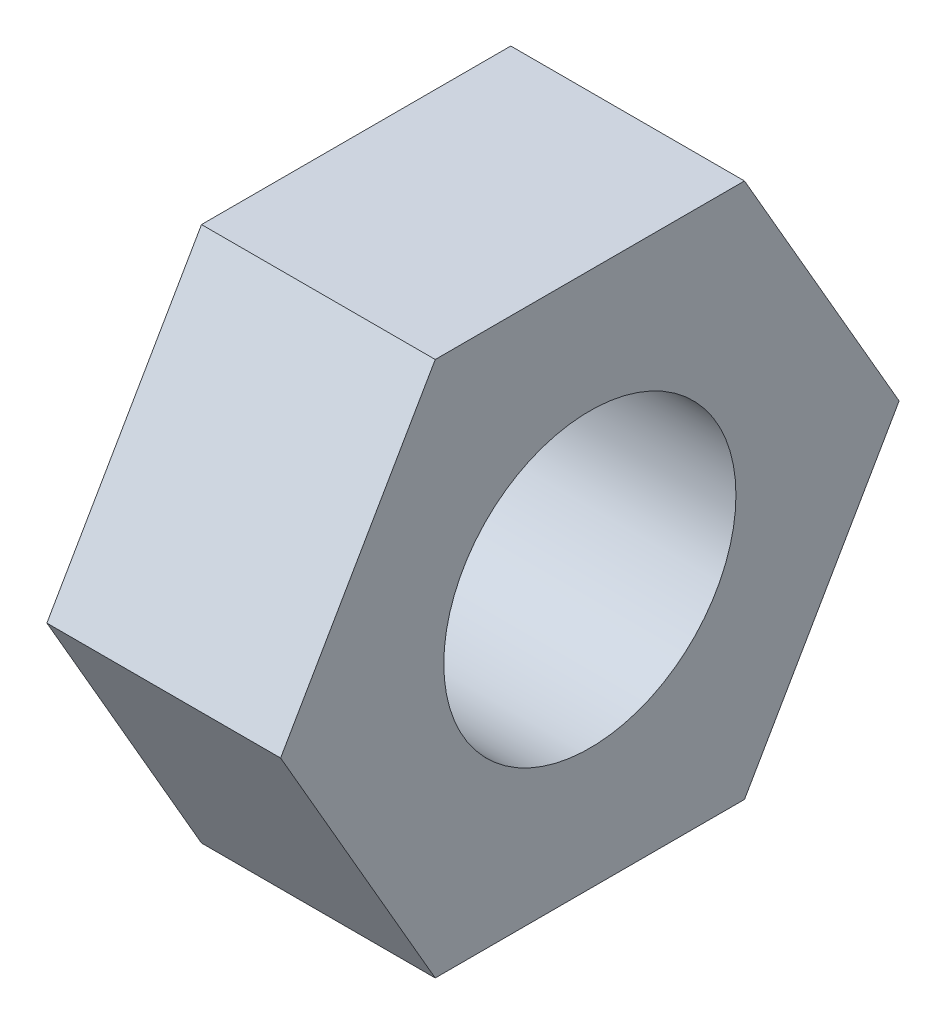
ISO-10303-21;
HEADER;
FILE_DESCRIPTION(('STEP AP214'),'2;1');
FILE_NAME('part.step','',(''),(''),'','','');
FILE_SCHEMA(('AUTOMOTIVE_DESIGN { 1 0 10303 214 1 1 1 1 }'));
ENDSEC;
DATA;
#1=APPLICATION_CONTEXT('core data for automotive mechanical design processes');
#2=APPLICATION_PROTOCOL_DEFINITION('international standard','automotive_design',2000,#1);
#3=PRODUCT_CONTEXT('',#1,'mechanical');
#4=PRODUCT('Part','Part','',(#3));
#5=PRODUCT_RELATED_PRODUCT_CATEGORY('part','',(#4));
#6=PRODUCT_DEFINITION_FORMATION('','',#4);
#7=PRODUCT_DEFINITION_CONTEXT('part definition',#1,'design');
#8=PRODUCT_DEFINITION('design','',#6,#7);
#9=PRODUCT_DEFINITION_SHAPE('','',#8);
#10=(LENGTH_UNIT() NAMED_UNIT(*) SI_UNIT(.MILLI.,.METRE.));
#11=(NAMED_UNIT(*) PLANE_ANGLE_UNIT() SI_UNIT($,.RADIAN.));
#12=(NAMED_UNIT(*) SI_UNIT($,.STERADIAN.) SOLID_ANGLE_UNIT());
#13=UNCERTAINTY_MEASURE_WITH_UNIT(LENGTH_MEASURE(1.E-05),#10,'distance_accuracy_value','');
#14=(GEOMETRIC_REPRESENTATION_CONTEXT(3) GLOBAL_UNCERTAINTY_ASSIGNED_CONTEXT((#13)) GLOBAL_UNIT_ASSIGNED_CONTEXT((#10,
#11,#12)) REPRESENTATION_CONTEXT('',''));
#15=CARTESIAN_POINT('',(0.,0.,0.));
#16=DIRECTION('',(0.,0.,1.));
#17=DIRECTION('',(1.,0.,0.));
#18=AXIS2_PLACEMENT_3D('',#15,#16,#17);
#19=CARTESIAN_POINT('',(23.1,-35.25,-13.0877132402715));
#20=DIRECTION('',(0.,-1.,0.));
#21=DIRECTION('',(0.,0.,-1.));
#22=AXIS2_PLACEMENT_3D('',#19,#20,#21);
#23=PLANE('',#22);
#24=DIRECTION('',(0.,0.,1.));
#25=VECTOR('',#24,1.);
#26=CARTESIAN_POINT('',(20.7,-35.25,-13.0877132402715));
#27=LINE('',#26,#25);
#28=CARTESIAN_POINT('',(20.7,-35.25,-13.0877132402715));
#29=VERTEX_POINT('',#28);
#30=CARTESIAN_POINT('',(20.7,-35.25,-9.91228675972853));
#31=VERTEX_POINT('',#30);
#32=EDGE_CURVE('E127',#29,#31,#27,.T.);
#33=ORIENTED_EDGE('',*,*,#32,.T.);
#34=DIRECTION('',(-1.,0.,0.));
#35=VECTOR('',#34,1.);
#36=CARTESIAN_POINT('',(23.1,-35.25,-9.91228675972853));
#37=LINE('',#36,#35);
#38=CARTESIAN_POINT('',(23.1,-35.25,-9.91228675972853));
#39=VERTEX_POINT('',#38);
#40=EDGE_CURVE('E11',#39,#31,#37,.T.);
#41=ORIENTED_EDGE('',*,*,#40,.F.);
#42=DIRECTION('',(0.,0.,1.));
#43=VECTOR('',#42,1.);
#44=CARTESIAN_POINT('',(23.1,-35.25,-13.0877132402715));
#45=LINE('',#44,#43);
#46=CARTESIAN_POINT('',(23.1,-35.25,-13.0877132402715));
#47=VERTEX_POINT('',#46);
#48=EDGE_CURVE('E140',#47,#39,#45,.T.);
#49=ORIENTED_EDGE('',*,*,#48,.F.);
#50=DIRECTION('',(-1.,0.,0.));
#51=VECTOR('',#50,1.);
#52=CARTESIAN_POINT('',(23.1,-35.25,-13.0877132402715));
#53=LINE('',#52,#51);
#54=EDGE_CURVE('E125',#47,#29,#53,.T.);
#55=ORIENTED_EDGE('',*,*,#54,.T.);
#56=EDGE_LOOP('',(#33,#41,#49,#55));
#57=FACE_BOUND('',#56,.T.);
#58=ADVANCED_FACE('F41',(#57),#23,.F.);
#59=CARTESIAN_POINT('',(23.1,-35.25,-9.91228675972853));
#60=DIRECTION('',(0.,-0.500000000000001,-0.866025403784438));
#61=DIRECTION('',(0.,0.866025403784438,-0.500000000000001));
#62=AXIS2_PLACEMENT_3D('',#59,#60,#61);
#63=PLANE('',#62);
#64=DIRECTION('',(0.,-0.866025403784438,0.500000000000001));
#65=VECTOR('',#64,1.);
#66=CARTESIAN_POINT('',(20.7,-35.25,-9.91228675972853));
#67=LINE('',#66,#65);
#68=CARTESIAN_POINT('',(20.7,-38.,-8.32457351945706));
#69=VERTEX_POINT('',#68);
#70=EDGE_CURVE('E129',#31,#69,#67,.T.);
#71=ORIENTED_EDGE('',*,*,#70,.T.);
#72=DIRECTION('',(-1.,0.,0.));
#73=VECTOR('',#72,1.);
#74=CARTESIAN_POINT('',(23.1,-38.,-8.32457351945706));
#75=LINE('',#74,#73);
#76=CARTESIAN_POINT('',(23.1,-38.,-8.32457351945706));
#77=VERTEX_POINT('',#76);
#78=EDGE_CURVE('E49',#77,#69,#75,.T.);
#79=ORIENTED_EDGE('',*,*,#78,.F.);
#80=DIRECTION('',(0.,-0.866025403784438,0.500000000000001));
#81=VECTOR('',#80,1.);
#82=CARTESIAN_POINT('',(23.1,-35.25,-9.91228675972853));
#83=LINE('',#82,#81);
#84=EDGE_CURVE('E92',#39,#77,#83,.T.);
#85=ORIENTED_EDGE('',*,*,#84,.F.);
#86=ORIENTED_EDGE('',*,*,#40,.T.);
#87=EDGE_LOOP('',(#71,#79,#85,#86));
#88=FACE_BOUND('',#87,.T.);
#89=ADVANCED_FACE('F162',(#88),#63,.F.);
#90=CARTESIAN_POINT('',(23.1,-38.,-8.32457351945706));
#91=DIRECTION('',(0.,0.5,-0.866025403784439));
#92=DIRECTION('',(0.,0.866025403784439,0.5));
#93=AXIS2_PLACEMENT_3D('',#90,#91,#92);
#94=PLANE('',#93);
#95=DIRECTION('',(0.,-0.866025403784439,-0.5));
#96=VECTOR('',#95,1.);
#97=CARTESIAN_POINT('',(20.7,-38.,-8.32457351945706));
#98=LINE('',#97,#96);
#99=CARTESIAN_POINT('',(20.7,-40.75,-9.91228675972853));
#100=VERTEX_POINT('',#99);
#101=EDGE_CURVE('E132',#69,#100,#98,.T.);
#102=ORIENTED_EDGE('',*,*,#101,.T.);
#103=DIRECTION('',(-1.,0.,0.));
#104=VECTOR('',#103,1.);
#105=CARTESIAN_POINT('',(23.1,-40.75,-9.91228675972853));
#106=LINE('',#105,#104);
#107=CARTESIAN_POINT('',(23.1,-40.75,-9.91228675972853));
#108=VERTEX_POINT('',#107);
#109=EDGE_CURVE('E117',#108,#100,#106,.T.);
#110=ORIENTED_EDGE('',*,*,#109,.F.);
#111=DIRECTION('',(0.,-0.866025403784439,-0.5));
#112=VECTOR('',#111,1.);
#113=CARTESIAN_POINT('',(23.1,-38.,-8.32457351945706));
#114=LINE('',#113,#112);
#115=EDGE_CURVE('E107',#77,#108,#114,.T.);
#116=ORIENTED_EDGE('',*,*,#115,.F.);
#117=ORIENTED_EDGE('',*,*,#78,.T.);
#118=EDGE_LOOP('',(#102,#110,#116,#117));
#119=FACE_BOUND('',#118,.T.);
#120=ADVANCED_FACE('F145',(#119),#94,.F.);
#121=CARTESIAN_POINT('',(23.1,-40.75,-9.91228675972853));
#122=DIRECTION('',(0.,1.,0.));
#123=DIRECTION('',(0.,0.,1.));
#124=AXIS2_PLACEMENT_3D('',#121,#122,#123);
#125=PLANE('',#124);
#126=DIRECTION('',(0.,0.,-1.));
#127=VECTOR('',#126,1.);
#128=CARTESIAN_POINT('',(20.7,-40.75,-9.91228675972853));
#129=LINE('',#128,#127);
#130=CARTESIAN_POINT('',(20.7,-40.75,-13.0877132402715));
#131=VERTEX_POINT('',#130);
#132=EDGE_CURVE('E116',#100,#131,#129,.T.);
#133=ORIENTED_EDGE('',*,*,#132,.T.);
#134=DIRECTION('',(-1.,0.,0.));
#135=VECTOR('',#134,1.);
#136=CARTESIAN_POINT('',(23.1,-40.75,-13.0877132402715));
#137=LINE('',#136,#135);
#138=CARTESIAN_POINT('',(23.1,-40.75,-13.0877132402715));
#139=VERTEX_POINT('',#138);
#140=EDGE_CURVE('E114',#139,#131,#137,.T.);
#141=ORIENTED_EDGE('',*,*,#140,.F.);
#142=DIRECTION('',(0.,0.,-1.));
#143=VECTOR('',#142,1.);
#144=CARTESIAN_POINT('',(23.1,-40.75,-9.91228675972853));
#145=LINE('',#144,#143);
#146=EDGE_CURVE('E105',#108,#139,#145,.T.);
#147=ORIENTED_EDGE('',*,*,#146,.F.);
#148=ORIENTED_EDGE('',*,*,#109,.T.);
#149=EDGE_LOOP('',(#133,#141,#147,#148));
#150=FACE_BOUND('',#149,.T.);
#151=ADVANCED_FACE('F111',(#150),#125,.F.);
#152=CARTESIAN_POINT('',(23.1,-40.75,-13.0877132402715));
#153=DIRECTION('',(0.,0.5,0.866025403784439));
#154=DIRECTION('',(0.,-0.866025403784439,0.5));
#155=AXIS2_PLACEMENT_3D('',#152,#153,#154);
#156=PLANE('',#155);
#157=DIRECTION('',(0.,0.866025403784439,-0.5));
#158=VECTOR('',#157,1.);
#159=CARTESIAN_POINT('',(20.7,-40.75,-13.0877132402715));
#160=LINE('',#159,#158);
#161=CARTESIAN_POINT('',(20.7,-38.,-14.6754264805429));
#162=VERTEX_POINT('',#161);
#163=EDGE_CURVE('E81',#131,#162,#160,.T.);
#164=ORIENTED_EDGE('',*,*,#163,.T.);
#165=DIRECTION('',(-1.,0.,0.));
#166=VECTOR('',#165,1.);
#167=CARTESIAN_POINT('',(23.1,-38.,-14.6754264805429));
#168=LINE('',#167,#166);
#169=CARTESIAN_POINT('',(23.1,-38.,-14.6754264805429));
#170=VERTEX_POINT('',#169);
#171=EDGE_CURVE('E119',#170,#162,#168,.T.);
#172=ORIENTED_EDGE('',*,*,#171,.F.);
#173=DIRECTION('',(0.,0.866025403784439,-0.5));
#174=VECTOR('',#173,1.);
#175=CARTESIAN_POINT('',(23.1,-40.75,-13.0877132402715));
#176=LINE('',#175,#174);
#177=EDGE_CURVE('E106',#139,#170,#176,.T.);
#178=ORIENTED_EDGE('',*,*,#177,.F.);
#179=ORIENTED_EDGE('',*,*,#140,.T.);
#180=EDGE_LOOP('',(#164,#172,#178,#179));
#181=FACE_BOUND('',#180,.T.);
#182=ADVANCED_FACE('F120',(#181),#156,.F.);
#183=CARTESIAN_POINT('',(23.1,-38.,-14.6754264805429));
#184=DIRECTION('',(0.,-0.500000000000001,0.866025403784438));
#185=DIRECTION('',(0.,-0.866025403784438,-0.500000000000001));
#186=AXIS2_PLACEMENT_3D('',#183,#184,#185);
#187=PLANE('',#186);
#188=DIRECTION('',(0.,0.866025403784438,0.500000000000001));
#189=VECTOR('',#188,1.);
#190=CARTESIAN_POINT('',(20.7,-38.,-14.6754264805429));
#191=LINE('',#190,#189);
#192=EDGE_CURVE('E87',#162,#29,#191,.T.);
#193=ORIENTED_EDGE('',*,*,#192,.T.);
#194=ORIENTED_EDGE('',*,*,#54,.F.);
#195=DIRECTION('',(0.,0.866025403784438,0.500000000000001));
#196=VECTOR('',#195,1.);
#197=CARTESIAN_POINT('',(23.1,-38.,-14.6754264805429));
#198=LINE('',#197,#196);
#199=EDGE_CURVE('E59',#170,#47,#198,.T.);
#200=ORIENTED_EDGE('',*,*,#199,.F.);
#201=ORIENTED_EDGE('',*,*,#171,.T.);
#202=EDGE_LOOP('',(#193,#194,#200,#201));
#203=FACE_BOUND('',#202,.T.);
#204=ADVANCED_FACE('F151',(#203),#187,.F.);
#205=CARTESIAN_POINT('',(23.1,0.,0.));
#206=DIRECTION('',(1.,0.,0.));
#207=DIRECTION('',(0.,0.,-1.));
#208=AXIS2_PLACEMENT_3D('',#205,#206,#207);
#209=PLANE('',#208);
#210=CARTESIAN_POINT('',(23.1,-38.,-11.5));
#211=DIRECTION('',(1.,0.,0.));
#212=DIRECTION('',(0.,0.,-1.));
#213=AXIS2_PLACEMENT_3D('',#210,#211,#212);
#214=CIRCLE('',#213,1.5);
#215=CARTESIAN_POINT('',(23.1,-38.,-13.));
#216=VERTEX_POINT('',#215);
#217=EDGE_CURVE('E128',#216,#216,#214,.F.);
#218=ORIENTED_EDGE('',*,*,#217,.T.);
#219=EDGE_LOOP('',(#218));
#220=FACE_BOUND('',#219,.T.);
#221=ORIENTED_EDGE('',*,*,#48,.T.);
#222=ORIENTED_EDGE('',*,*,#84,.T.);
#223=ORIENTED_EDGE('',*,*,#115,.T.);
#224=ORIENTED_EDGE('',*,*,#146,.T.);
#225=ORIENTED_EDGE('',*,*,#177,.T.);
#226=ORIENTED_EDGE('',*,*,#199,.T.);
#227=EDGE_LOOP('',(#221,#222,#223,#224,#225,#226));
#228=FACE_BOUND('',#227,.T.);
#229=ADVANCED_FACE('F102',(#220,#228),#209,.T.);
#230=CARTESIAN_POINT('',(20.7,0.,0.));
#231=DIRECTION('',(1.,0.,0.));
#232=DIRECTION('',(0.,0.,-1.));
#233=AXIS2_PLACEMENT_3D('',#230,#231,#232);
#234=PLANE('',#233);
#235=CARTESIAN_POINT('',(20.7,-38.,-11.5));
#236=DIRECTION('',(1.,0.,0.));
#237=DIRECTION('',(0.,0.,-1.));
#238=AXIS2_PLACEMENT_3D('',#235,#236,#237);
#239=CIRCLE('',#238,1.5);
#240=CARTESIAN_POINT('',(20.7,-38.,-13.));
#241=VERTEX_POINT('',#240);
#242=EDGE_CURVE('E42',#241,#241,#239,.F.);
#243=ORIENTED_EDGE('',*,*,#242,.F.);
#244=EDGE_LOOP('',(#243));
#245=FACE_BOUND('',#244,.T.);
#246=ORIENTED_EDGE('',*,*,#32,.F.);
#247=ORIENTED_EDGE('',*,*,#192,.F.);
#248=ORIENTED_EDGE('',*,*,#163,.F.);
#249=ORIENTED_EDGE('',*,*,#132,.F.);
#250=ORIENTED_EDGE('',*,*,#101,.F.);
#251=ORIENTED_EDGE('',*,*,#70,.F.);
#252=EDGE_LOOP('',(#246,#247,#248,#249,#250,#251));
#253=FACE_BOUND('',#252,.T.);
#254=ADVANCED_FACE('F150',(#245,#253),#234,.F.);
#255=CARTESIAN_POINT('',(23.2,-38.,-11.5));
#256=DIRECTION('',(-1.,0.,0.));
#257=DIRECTION('',(0.,0.,1.));
#258=AXIS2_PLACEMENT_3D('',#255,#256,#257);
#259=CYLINDRICAL_SURFACE('',#258,1.5);
#260=ORIENTED_EDGE('',*,*,#217,.F.);
#261=EDGE_LOOP('',(#260));
#262=FACE_BOUND('',#261,.T.);
#263=ORIENTED_EDGE('',*,*,#242,.T.);
#264=EDGE_LOOP('',(#263));
#265=FACE_BOUND('',#264,.T.);
#266=ADVANCED_FACE('F205',(#262,#265),#259,.F.);
#267=CLOSED_SHELL('',(#58,#89,#120,#151,#182,#204,#229,#254,#266));
#268=MANIFOLD_SOLID_BREP('B2',#267);
#269=ADVANCED_BREP_SHAPE_REPRESENTATION('',(#18,#268),#14);
#270=SHAPE_DEFINITION_REPRESENTATION(#9,#269);
ENDSEC;
END-ISO-10303-21;
